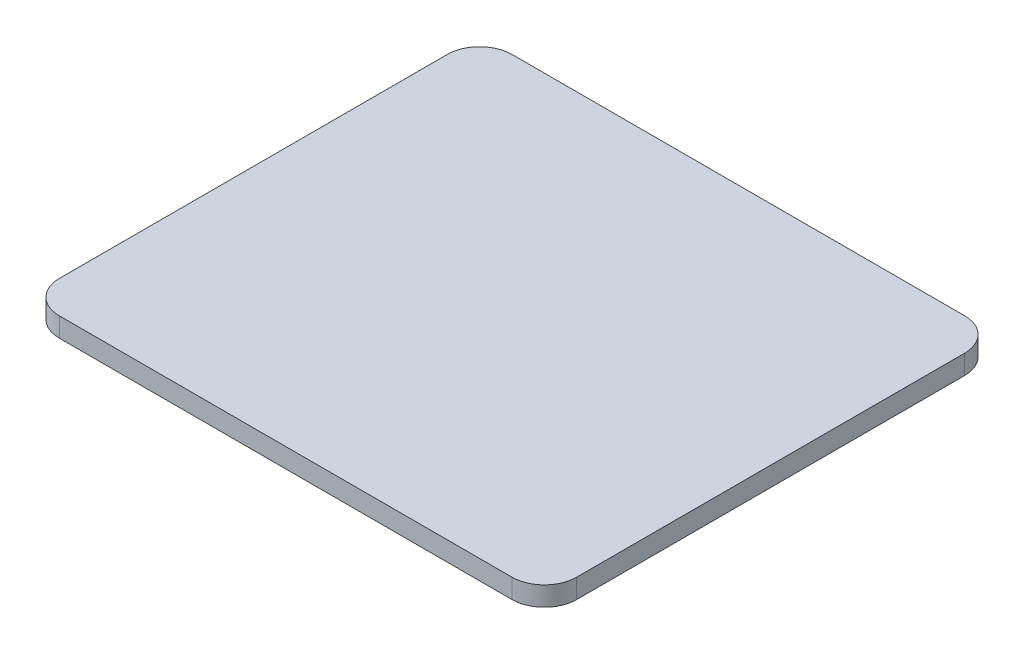
ISO-10303-21;
HEADER;
FILE_DESCRIPTION(('STEP AP214'),'2;1');
FILE_NAME('part.step','',(''),(''),'','','');
FILE_SCHEMA(('AUTOMOTIVE_DESIGN { 1 0 10303 214 1 1 1 1 }'));
ENDSEC;
DATA;
#1=APPLICATION_CONTEXT('core data for automotive mechanical design processes');
#2=APPLICATION_PROTOCOL_DEFINITION('international standard','automotive_design',2000,#1);
#3=PRODUCT_CONTEXT('',#1,'mechanical');
#4=PRODUCT('Part','Part','',(#3));
#5=PRODUCT_RELATED_PRODUCT_CATEGORY('part','',(#4));
#6=PRODUCT_DEFINITION_FORMATION('','',#4);
#7=PRODUCT_DEFINITION_CONTEXT('part definition',#1,'design');
#8=PRODUCT_DEFINITION('design','',#6,#7);
#9=PRODUCT_DEFINITION_SHAPE('','',#8);
#10=(LENGTH_UNIT() NAMED_UNIT(*) SI_UNIT(.MILLI.,.METRE.));
#11=(NAMED_UNIT(*) PLANE_ANGLE_UNIT() SI_UNIT($,.RADIAN.));
#12=(NAMED_UNIT(*) SI_UNIT($,.STERADIAN.) SOLID_ANGLE_UNIT());
#13=UNCERTAINTY_MEASURE_WITH_UNIT(LENGTH_MEASURE(1.E-05),#10,'distance_accuracy_value','');
#14=(GEOMETRIC_REPRESENTATION_CONTEXT(3) GLOBAL_UNCERTAINTY_ASSIGNED_CONTEXT((#13)) GLOBAL_UNIT_ASSIGNED_CONTEXT((#10,
#11,#12)) REPRESENTATION_CONTEXT('',''));
#15=CARTESIAN_POINT('',(0.,0.,0.));
#16=DIRECTION('',(0.,0.,1.));
#17=DIRECTION('',(1.,0.,0.));
#18=AXIS2_PLACEMENT_3D('',#15,#16,#17);
#19=CARTESIAN_POINT('',(7.,0.,0.));
#20=DIRECTION('',(-1.,0.,0.));
#21=DIRECTION('',(0.,0.,1.));
#22=AXIS2_PLACEMENT_3D('',#19,#20,#21);
#23=CYLINDRICAL_SURFACE('',#22,1.);
#24=CARTESIAN_POINT('',(4.4,0.,0.));
#25=DIRECTION('',(1.,0.,0.));
#26=DIRECTION('',(0.,0.,-1.));
#27=AXIS2_PLACEMENT_3D('',#24,#25,#26);
#28=CIRCLE('',#27,1.);
#29=CARTESIAN_POINT('',(4.4,0.,-1.));
#30=VERTEX_POINT('',#29);
#31=EDGE_CURVE('E186',#30,#30,#28,.T.);
#32=ORIENTED_EDGE('',*,*,#31,.T.);
#33=EDGE_LOOP('',(#32));
#34=FACE_BOUND('',#33,.T.);
#35=CARTESIAN_POINT('',(2.2,0.,0.));
#36=DIRECTION('',(-1.,0.,0.));
#37=DIRECTION('',(0.,0.,1.));
#38=AXIS2_PLACEMENT_3D('',#35,#36,#37);
#39=CIRCLE('',#38,1.);
#40=CARTESIAN_POINT('',(2.2,0.,1.));
#41=VERTEX_POINT('',#40);
#42=EDGE_CURVE('E43',#41,#41,#39,.T.);
#43=ORIENTED_EDGE('',*,*,#42,.T.);
#44=EDGE_LOOP('',(#43));
#45=FACE_BOUND('',#44,.T.);
#46=ADVANCED_FACE('F39',(#34,#45),#23,.F.);
#47=CARTESIAN_POINT('',(7.,0.,0.));
#48=DIRECTION('',(1.,0.,0.));
#49=DIRECTION('',(0.,0.,-1.));
#50=AXIS2_PLACEMENT_3D('',#47,#48,#49);
#51=PLANE('',#50);
#52=CARTESIAN_POINT('',(7.,0.,0.));
#53=DIRECTION('',(1.,0.,0.));
#54=DIRECTION('',(0.,0.,-1.));
#55=AXIS2_PLACEMENT_3D('',#52,#53,#54);
#56=CIRCLE('',#55,2.5);
#57=CARTESIAN_POINT('',(7.,0.,-2.5));
#58=VERTEX_POINT('',#57);
#59=EDGE_CURVE('E194',#58,#58,#56,.T.);
#60=ORIENTED_EDGE('',*,*,#59,.F.);
#61=EDGE_LOOP('',(#60));
#62=FACE_BOUND('',#61,.T.);
#63=CARTESIAN_POINT('',(7.,0.,0.));
#64=DIRECTION('',(1.,0.,0.));
#65=DIRECTION('',(0.,0.,-1.));
#66=AXIS2_PLACEMENT_3D('',#63,#64,#65);
#67=CIRCLE('',#66,5.);
#68=CARTESIAN_POINT('',(7.,0.,5.));
#69=VERTEX_POINT('',#68);
#70=CARTESIAN_POINT('',(7.,0.,-5.));
#71=VERTEX_POINT('',#70);
#72=EDGE_CURVE('E170',#69,#71,#67,.T.);
#73=ORIENTED_EDGE('',*,*,#72,.T.);
#74=DIRECTION('',(0.,1.,0.));
#75=VECTOR('',#74,1.);
#76=CARTESIAN_POINT('',(7.,0.,-5.));
#77=LINE('',#76,#75);
#78=CARTESIAN_POINT('',(7.,20.,-5.));
#79=VERTEX_POINT('',#78);
#80=EDGE_CURVE('E82',#71,#79,#77,.T.);
#81=ORIENTED_EDGE('',*,*,#80,.T.);
#82=DIRECTION('',(0.,0.,1.));
#83=VECTOR('',#82,1.);
#84=CARTESIAN_POINT('',(7.,20.,5.));
#85=LINE('',#84,#83);
#86=CARTESIAN_POINT('',(7.,20.,5.));
#87=VERTEX_POINT('',#86);
#88=EDGE_CURVE('E173',#79,#87,#85,.T.);
#89=ORIENTED_EDGE('',*,*,#88,.T.);
#90=DIRECTION('',(0.,-1.,0.));
#91=VECTOR('',#90,1.);
#92=CARTESIAN_POINT('',(7.,0.,5.));
#93=LINE('',#92,#91);
#94=EDGE_CURVE('E58',#87,#69,#93,.T.);
#95=ORIENTED_EDGE('',*,*,#94,.T.);
#96=EDGE_LOOP('',(#73,#81,#89,#95));
#97=FACE_BOUND('',#96,.T.);
#98=ADVANCED_FACE('F273',(#62,#97),#51,.T.);
#99=CARTESIAN_POINT('',(0.,0.,0.));
#100=DIRECTION('',(1.,0.,0.));
#101=DIRECTION('',(0.,0.,-1.));
#102=AXIS2_PLACEMENT_3D('',#99,#100,#101);
#103=PLANE('',#102);
#104=CARTESIAN_POINT('',(0.,0.,0.));
#105=DIRECTION('',(-1.,0.,0.));
#106=DIRECTION('',(0.,0.,1.));
#107=AXIS2_PLACEMENT_3D('',#104,#105,#106);
#108=CIRCLE('',#107,2.6);
#109=CARTESIAN_POINT('',(0.,0.,2.6));
#110=VERTEX_POINT('',#109);
#111=EDGE_CURVE('E201',#110,#110,#108,.T.);
#112=ORIENTED_EDGE('',*,*,#111,.F.);
#113=EDGE_LOOP('',(#112));
#114=FACE_BOUND('',#113,.T.);
#115=CARTESIAN_POINT('',(0.,0.,0.));
#116=DIRECTION('',(1.,0.,0.));
#117=DIRECTION('',(0.,0.,-1.));
#118=AXIS2_PLACEMENT_3D('',#115,#116,#117);
#119=CIRCLE('',#118,5.);
#120=CARTESIAN_POINT('',(0.,0.,5.));
#121=VERTEX_POINT('',#120);
#122=CARTESIAN_POINT('',(0.,0.,-5.));
#123=VERTEX_POINT('',#122);
#124=EDGE_CURVE('E161',#121,#123,#119,.T.);
#125=ORIENTED_EDGE('',*,*,#124,.F.);
#126=DIRECTION('',(0.,-1.,0.));
#127=VECTOR('',#126,1.);
#128=CARTESIAN_POINT('',(0.,0.,5.));
#129=LINE('',#128,#127);
#130=CARTESIAN_POINT('',(0.,20.,5.));
#131=VERTEX_POINT('',#130);
#132=EDGE_CURVE('E75',#131,#121,#129,.T.);
#133=ORIENTED_EDGE('',*,*,#132,.F.);
#134=DIRECTION('',(0.,0.,1.));
#135=VECTOR('',#134,1.);
#136=CARTESIAN_POINT('',(0.,20.,5.));
#137=LINE('',#136,#135);
#138=CARTESIAN_POINT('',(0.,20.,-5.));
#139=VERTEX_POINT('',#138);
#140=EDGE_CURVE('E179',#139,#131,#137,.T.);
#141=ORIENTED_EDGE('',*,*,#140,.F.);
#142=DIRECTION('',(0.,1.,0.));
#143=VECTOR('',#142,1.);
#144=CARTESIAN_POINT('',(0.,0.,-5.));
#145=LINE('',#144,#143);
#146=EDGE_CURVE('E164',#123,#139,#145,.T.);
#147=ORIENTED_EDGE('',*,*,#146,.F.);
#148=EDGE_LOOP('',(#125,#133,#141,#147));
#149=FACE_BOUND('',#148,.T.);
#150=ADVANCED_FACE('F280',(#114,#149),#103,.F.);
#151=CARTESIAN_POINT('',(7.,0.,0.));
#152=DIRECTION('',(-1.,0.,0.));
#153=DIRECTION('',(0.,0.,1.));
#154=AXIS2_PLACEMENT_3D('',#151,#152,#153);
#155=CYLINDRICAL_SURFACE('',#154,5.);
#156=ORIENTED_EDGE('',*,*,#124,.T.);
#157=DIRECTION('',(-1.,0.,0.));
#158=VECTOR('',#157,1.);
#159=CARTESIAN_POINT('',(7.,0.,-5.));
#160=LINE('',#159,#158);
#161=EDGE_CURVE('E11',#71,#123,#160,.T.);
#162=ORIENTED_EDGE('',*,*,#161,.F.);
#163=ORIENTED_EDGE('',*,*,#72,.F.);
#164=DIRECTION('',(-1.,0.,0.));
#165=VECTOR('',#164,1.);
#166=CARTESIAN_POINT('',(7.,0.,5.));
#167=LINE('',#166,#165);
#168=EDGE_CURVE('E175',#69,#121,#167,.T.);
#169=ORIENTED_EDGE('',*,*,#168,.T.);
#170=EDGE_LOOP('',(#156,#162,#163,#169));
#171=FACE_BOUND('',#170,.T.);
#172=ADVANCED_FACE('F41',(#171),#155,.T.);
#173=CARTESIAN_POINT('',(7.,0.,-5.));
#174=DIRECTION('',(0.,0.,1.));
#175=DIRECTION('',(1.,0.,0.));
#176=AXIS2_PLACEMENT_3D('',#173,#174,#175);
#177=PLANE('',#176);
#178=ORIENTED_EDGE('',*,*,#146,.T.);
#179=DIRECTION('',(-1.,0.,0.));
#180=VECTOR('',#179,1.);
#181=CARTESIAN_POINT('',(7.,20.,-5.));
#182=LINE('',#181,#180);
#183=EDGE_CURVE('E49',#79,#139,#182,.T.);
#184=ORIENTED_EDGE('',*,*,#183,.F.);
#185=ORIENTED_EDGE('',*,*,#80,.F.);
#186=ORIENTED_EDGE('',*,*,#161,.T.);
#187=EDGE_LOOP('',(#178,#184,#185,#186));
#188=FACE_BOUND('',#187,.T.);
#189=ADVANCED_FACE('F290',(#188),#177,.F.);
#190=CARTESIAN_POINT('',(7.,0.,5.));
#191=DIRECTION('',(0.,0.,-1.));
#192=DIRECTION('',(-1.,0.,0.));
#193=AXIS2_PLACEMENT_3D('',#190,#191,#192);
#194=PLANE('',#193);
#195=ORIENTED_EDGE('',*,*,#132,.T.);
#196=ORIENTED_EDGE('',*,*,#168,.F.);
#197=ORIENTED_EDGE('',*,*,#94,.F.);
#198=DIRECTION('',(-1.,0.,0.));
#199=VECTOR('',#198,1.);
#200=CARTESIAN_POINT('',(7.,20.,5.));
#201=LINE('',#200,#199);
#202=EDGE_CURVE('E72',#87,#131,#201,.T.);
#203=ORIENTED_EDGE('',*,*,#202,.T.);
#204=EDGE_LOOP('',(#195,#196,#197,#203));
#205=FACE_BOUND('',#204,.T.);
#206=ADVANCED_FACE('F288',(#205),#194,.F.);
#207=CARTESIAN_POINT('',(42.1024787786415,23.,-30.));
#208=DIRECTION('',(0.,-1.,0.));
#209=DIRECTION('',(0.,0.,-1.));
#210=AXIS2_PLACEMENT_3D('',#207,#208,#209);
#211=CYLINDRICAL_SURFACE('',#210,5.);
#212=CARTESIAN_POINT('',(42.1024787786415,20.,-30.));
#213=DIRECTION('',(0.,1.,0.));
#214=DIRECTION('',(0.,0.,-1.));
#215=AXIS2_PLACEMENT_3D('',#212,#213,#214);
#216=CIRCLE('',#215,5.);
#217=CARTESIAN_POINT('',(47.1024787786415,20.,-30.));
#218=VERTEX_POINT('',#217);
#219=CARTESIAN_POINT('',(42.1024787786415,20.,-35.));
#220=VERTEX_POINT('',#219);
#221=EDGE_CURVE('E160',#218,#220,#216,.T.);
#222=ORIENTED_EDGE('',*,*,#221,.T.);
#223=DIRECTION('',(0.,-1.,0.));
#224=VECTOR('',#223,1.);
#225=CARTESIAN_POINT('',(42.1024787786415,23.,-35.));
#226=LINE('',#225,#224);
#227=CARTESIAN_POINT('',(42.1024787786415,23.,-35.));
#228=VERTEX_POINT('',#227);
#229=EDGE_CURVE('E140',#228,#220,#226,.T.);
#230=ORIENTED_EDGE('',*,*,#229,.F.);
#231=CARTESIAN_POINT('',(42.1024787786415,23.,-30.));
#232=DIRECTION('',(0.,1.,0.));
#233=DIRECTION('',(0.,0.,-1.));
#234=AXIS2_PLACEMENT_3D('',#231,#232,#233);
#235=CIRCLE('',#234,5.);
#236=CARTESIAN_POINT('',(47.1024787786415,23.,-30.));
#237=VERTEX_POINT('',#236);
#238=EDGE_CURVE('E147',#237,#228,#235,.T.);
#239=ORIENTED_EDGE('',*,*,#238,.F.);
#240=DIRECTION('',(0.,-1.,0.));
#241=VECTOR('',#240,1.);
#242=CARTESIAN_POINT('',(47.1024787786415,23.,-30.));
#243=LINE('',#242,#241);
#244=EDGE_CURVE('E213',#237,#218,#243,.T.);
#245=ORIENTED_EDGE('',*,*,#244,.T.);
#246=EDGE_LOOP('',(#222,#230,#239,#245));
#247=FACE_BOUND('',#246,.T.);
#248=ADVANCED_FACE('F158',(#247),#211,.T.);
#249=CARTESIAN_POINT('',(-27.8975212213585,23.,-35.));
#250=DIRECTION('',(0.,0.,1.));
#251=DIRECTION('',(1.,0.,0.));
#252=AXIS2_PLACEMENT_3D('',#249,#250,#251);
#253=PLANE('',#252);
#254=DIRECTION('',(-1.,0.,0.));
#255=VECTOR('',#254,1.);
#256=CARTESIAN_POINT('',(-27.8975212213585,20.,-35.));
#257=LINE('',#256,#255);
#258=CARTESIAN_POINT('',(-27.8975212213585,20.,-35.));
#259=VERTEX_POINT('',#258);
#260=EDGE_CURVE('E191',#220,#259,#257,.T.);
#261=ORIENTED_EDGE('',*,*,#260,.T.);
#262=DIRECTION('',(0.,-1.,0.));
#263=VECTOR('',#262,1.);
#264=CARTESIAN_POINT('',(-27.8975212213585,23.,-35.));
#265=LINE('',#264,#263);
#266=CARTESIAN_POINT('',(-27.8975212213585,23.,-35.));
#267=VERTEX_POINT('',#266);
#268=EDGE_CURVE('E143',#267,#259,#265,.T.);
#269=ORIENTED_EDGE('',*,*,#268,.F.);
#270=DIRECTION('',(-1.,0.,0.));
#271=VECTOR('',#270,1.);
#272=CARTESIAN_POINT('',(-27.8975212213585,23.,-35.));
#273=LINE('',#272,#271);
#274=EDGE_CURVE('E136',#228,#267,#273,.T.);
#275=ORIENTED_EDGE('',*,*,#274,.F.);
#276=ORIENTED_EDGE('',*,*,#229,.T.);
#277=EDGE_LOOP('',(#261,#269,#275,#276));
#278=FACE_BOUND('',#277,.T.);
#279=ADVANCED_FACE('F138',(#278),#253,.F.);
#280=CARTESIAN_POINT('',(-27.8975212213585,23.,-30.));
#281=DIRECTION('',(0.,-1.,0.));
#282=DIRECTION('',(0.,0.,-1.));
#283=AXIS2_PLACEMENT_3D('',#280,#281,#282);
#284=CYLINDRICAL_SURFACE('',#283,5.);
#285=CARTESIAN_POINT('',(-27.8975212213585,20.,-30.));
#286=DIRECTION('',(0.,1.,0.));
#287=DIRECTION('',(0.,0.,-1.));
#288=AXIS2_PLACEMENT_3D('',#285,#286,#287);
#289=CIRCLE('',#288,5.);
#290=CARTESIAN_POINT('',(-32.8975212213585,20.,-30.));
#291=VERTEX_POINT('',#290);
#292=EDGE_CURVE('E216',#259,#291,#289,.T.);
#293=ORIENTED_EDGE('',*,*,#292,.T.);
#294=DIRECTION('',(0.,-1.,0.));
#295=VECTOR('',#294,1.);
#296=CARTESIAN_POINT('',(-32.8975212213585,23.,-30.));
#297=LINE('',#296,#295);
#298=CARTESIAN_POINT('',(-32.8975212213585,23.,-30.));
#299=VERTEX_POINT('',#298);
#300=EDGE_CURVE('E166',#299,#291,#297,.T.);
#301=ORIENTED_EDGE('',*,*,#300,.F.);
#302=CARTESIAN_POINT('',(-27.8975212213585,23.,-30.));
#303=DIRECTION('',(0.,1.,0.));
#304=DIRECTION('',(0.,0.,-1.));
#305=AXIS2_PLACEMENT_3D('',#302,#303,#304);
#306=CIRCLE('',#305,5.);
#307=EDGE_CURVE('E146',#267,#299,#306,.T.);
#308=ORIENTED_EDGE('',*,*,#307,.F.);
#309=ORIENTED_EDGE('',*,*,#268,.T.);
#310=EDGE_LOOP('',(#293,#301,#308,#309));
#311=FACE_BOUND('',#310,.T.);
#312=ADVANCED_FACE('F263',(#311),#284,.T.);
#313=CARTESIAN_POINT('',(-32.8975212213585,23.,30.));
#314=DIRECTION('',(1.,0.,0.));
#315=DIRECTION('',(0.,0.,-1.));
#316=AXIS2_PLACEMENT_3D('',#313,#314,#315);
#317=PLANE('',#316);
#318=DIRECTION('',(0.,0.,1.));
#319=VECTOR('',#318,1.);
#320=CARTESIAN_POINT('',(-32.8975212213585,20.,30.));
#321=LINE('',#320,#319);
#322=CARTESIAN_POINT('',(-32.8975212213585,20.,30.));
#323=VERTEX_POINT('',#322);
#324=EDGE_CURVE('E218',#291,#323,#321,.T.);
#325=ORIENTED_EDGE('',*,*,#324,.T.);
#326=DIRECTION('',(0.,-1.,0.));
#327=VECTOR('',#326,1.);
#328=CARTESIAN_POINT('',(-32.8975212213585,23.,30.));
#329=LINE('',#328,#327);
#330=CARTESIAN_POINT('',(-32.8975212213585,23.,30.));
#331=VERTEX_POINT('',#330);
#332=EDGE_CURVE('E237',#331,#323,#329,.T.);
#333=ORIENTED_EDGE('',*,*,#332,.F.);
#334=DIRECTION('',(0.,0.,1.));
#335=VECTOR('',#334,1.);
#336=CARTESIAN_POINT('',(-32.8975212213585,23.,30.));
#337=LINE('',#336,#335);
#338=EDGE_CURVE('E205',#299,#331,#337,.T.);
#339=ORIENTED_EDGE('',*,*,#338,.F.);
#340=ORIENTED_EDGE('',*,*,#300,.T.);
#341=EDGE_LOOP('',(#325,#333,#339,#340));
#342=FACE_BOUND('',#341,.T.);
#343=ADVANCED_FACE('F244',(#342),#317,.F.);
#344=CARTESIAN_POINT('',(-27.8975212213585,23.,30.));
#345=DIRECTION('',(0.,-1.,0.));
#346=DIRECTION('',(0.,0.,-1.));
#347=AXIS2_PLACEMENT_3D('',#344,#345,#346);
#348=CYLINDRICAL_SURFACE('',#347,5.);
#349=CARTESIAN_POINT('',(-27.8975212213585,20.,30.));
#350=DIRECTION('',(0.,1.,0.));
#351=DIRECTION('',(0.,0.,-1.));
#352=AXIS2_PLACEMENT_3D('',#349,#350,#351);
#353=CIRCLE('',#352,5.);
#354=CARTESIAN_POINT('',(-27.8975212213585,20.,35.));
#355=VERTEX_POINT('',#354);
#356=EDGE_CURVE('E220',#323,#355,#353,.T.);
#357=ORIENTED_EDGE('',*,*,#356,.T.);
#358=DIRECTION('',(0.,-1.,0.));
#359=VECTOR('',#358,1.);
#360=CARTESIAN_POINT('',(-27.8975212213585,23.,35.));
#361=LINE('',#360,#359);
#362=CARTESIAN_POINT('',(-27.8975212213585,23.,35.));
#363=VERTEX_POINT('',#362);
#364=EDGE_CURVE('E234',#363,#355,#361,.T.);
#365=ORIENTED_EDGE('',*,*,#364,.F.);
#366=CARTESIAN_POINT('',(-27.8975212213585,23.,30.));
#367=DIRECTION('',(0.,1.,0.));
#368=DIRECTION('',(0.,0.,-1.));
#369=AXIS2_PLACEMENT_3D('',#366,#367,#368);
#370=CIRCLE('',#369,5.);
#371=EDGE_CURVE('E207',#331,#363,#370,.T.);
#372=ORIENTED_EDGE('',*,*,#371,.F.);
#373=ORIENTED_EDGE('',*,*,#332,.T.);
#374=EDGE_LOOP('',(#357,#365,#372,#373));
#375=FACE_BOUND('',#374,.T.);
#376=ADVANCED_FACE('F255',(#375),#348,.T.);
#377=CARTESIAN_POINT('',(-27.8975212213585,23.,35.));
#378=DIRECTION('',(0.,0.,-1.));
#379=DIRECTION('',(-1.,0.,0.));
#380=AXIS2_PLACEMENT_3D('',#377,#378,#379);
#381=PLANE('',#380);
#382=DIRECTION('',(1.,0.,0.));
#383=VECTOR('',#382,1.);
#384=CARTESIAN_POINT('',(-27.8975212213585,20.,35.));
#385=LINE('',#384,#383);
#386=CARTESIAN_POINT('',(42.1024787786415,20.,35.));
#387=VERTEX_POINT('',#386);
#388=EDGE_CURVE('E222',#355,#387,#385,.T.);
#389=ORIENTED_EDGE('',*,*,#388,.T.);
#390=DIRECTION('',(0.,-1.,0.));
#391=VECTOR('',#390,1.);
#392=CARTESIAN_POINT('',(42.1024787786415,23.,35.));
#393=LINE('',#392,#391);
#394=CARTESIAN_POINT('',(42.1024787786415,23.,35.));
#395=VERTEX_POINT('',#394);
#396=EDGE_CURVE('E231',#395,#387,#393,.T.);
#397=ORIENTED_EDGE('',*,*,#396,.F.);
#398=DIRECTION('',(1.,0.,0.));
#399=VECTOR('',#398,1.);
#400=CARTESIAN_POINT('',(-27.8975212213585,23.,35.));
#401=LINE('',#400,#399);
#402=EDGE_CURVE('E209',#363,#395,#401,.T.);
#403=ORIENTED_EDGE('',*,*,#402,.F.);
#404=ORIENTED_EDGE('',*,*,#364,.T.);
#405=EDGE_LOOP('',(#389,#397,#403,#404));
#406=FACE_BOUND('',#405,.T.);
#407=ADVANCED_FACE('F259',(#406),#381,.F.);
#408=CARTESIAN_POINT('',(42.1024787786415,23.,30.));
#409=DIRECTION('',(0.,-1.,0.));
#410=DIRECTION('',(0.,0.,-1.));
#411=AXIS2_PLACEMENT_3D('',#408,#409,#410);
#412=CYLINDRICAL_SURFACE('',#411,5.);
#413=CARTESIAN_POINT('',(42.1024787786415,20.,30.));
#414=DIRECTION('',(0.,1.,0.));
#415=DIRECTION('',(0.,0.,1.));
#416=AXIS2_PLACEMENT_3D('',#413,#414,#415);
#417=CIRCLE('',#416,5.);
#418=CARTESIAN_POINT('',(47.1024787786415,20.,30.));
#419=VERTEX_POINT('',#418);
#420=EDGE_CURVE('E224',#387,#419,#417,.T.);
#421=ORIENTED_EDGE('',*,*,#420,.T.);
#422=DIRECTION('',(0.,-1.,0.));
#423=VECTOR('',#422,1.);
#424=CARTESIAN_POINT('',(47.1024787786415,23.,30.));
#425=LINE('',#424,#423);
#426=CARTESIAN_POINT('',(47.1024787786415,23.,30.));
#427=VERTEX_POINT('',#426);
#428=EDGE_CURVE('E228',#427,#419,#425,.T.);
#429=ORIENTED_EDGE('',*,*,#428,.F.);
#430=CARTESIAN_POINT('',(42.1024787786415,23.,30.));
#431=DIRECTION('',(0.,1.,0.));
#432=DIRECTION('',(0.,0.,1.));
#433=AXIS2_PLACEMENT_3D('',#430,#431,#432);
#434=CIRCLE('',#433,5.);
#435=EDGE_CURVE('E211',#395,#427,#434,.T.);
#436=ORIENTED_EDGE('',*,*,#435,.F.);
#437=ORIENTED_EDGE('',*,*,#396,.T.);
#438=EDGE_LOOP('',(#421,#429,#436,#437));
#439=FACE_BOUND('',#438,.T.);
#440=ADVANCED_FACE('F317',(#439),#412,.T.);
#441=CARTESIAN_POINT('',(47.1024787786415,23.,30.));
#442=DIRECTION('',(-1.,0.,0.));
#443=DIRECTION('',(0.,0.,1.));
#444=AXIS2_PLACEMENT_3D('',#441,#442,#443);
#445=PLANE('',#444);
#446=DIRECTION('',(0.,0.,-1.));
#447=VECTOR('',#446,1.);
#448=CARTESIAN_POINT('',(47.1024787786415,20.,30.));
#449=LINE('',#448,#447);
#450=EDGE_CURVE('E156',#419,#218,#449,.T.);
#451=ORIENTED_EDGE('',*,*,#450,.T.);
#452=ORIENTED_EDGE('',*,*,#244,.F.);
#453=DIRECTION('',(0.,0.,-1.));
#454=VECTOR('',#453,1.);
#455=CARTESIAN_POINT('',(47.1024787786415,23.,30.));
#456=LINE('',#455,#454);
#457=EDGE_CURVE('E152',#427,#237,#456,.T.);
#458=ORIENTED_EDGE('',*,*,#457,.F.);
#459=ORIENTED_EDGE('',*,*,#428,.T.);
#460=EDGE_LOOP('',(#451,#452,#458,#459));
#461=FACE_BOUND('',#460,.T.);
#462=ADVANCED_FACE('F312',(#461),#445,.F.);
#463=CARTESIAN_POINT('',(42.1024787786415,23.,-30.));
#464=DIRECTION('',(0.,-1.,0.));
#465=DIRECTION('',(0.,0.,-1.));
#466=AXIS2_PLACEMENT_3D('',#463,#464,#465);
#467=PLANE('',#466);
#468=ORIENTED_EDGE('',*,*,#238,.T.);
#469=ORIENTED_EDGE('',*,*,#274,.T.);
#470=ORIENTED_EDGE('',*,*,#307,.T.);
#471=ORIENTED_EDGE('',*,*,#338,.T.);
#472=ORIENTED_EDGE('',*,*,#371,.T.);
#473=ORIENTED_EDGE('',*,*,#402,.T.);
#474=ORIENTED_EDGE('',*,*,#435,.T.);
#475=ORIENTED_EDGE('',*,*,#457,.T.);
#476=EDGE_LOOP('',(#468,#469,#470,#471,#472,#473,#474,#475));
#477=FACE_BOUND('',#476,.T.);
#478=ADVANCED_FACE('F150',(#477),#467,.F.);
#479=CARTESIAN_POINT('',(42.1024787786415,20.,-30.));
#480=DIRECTION('',(0.,-1.,0.));
#481=DIRECTION('',(0.,0.,-1.));
#482=AXIS2_PLACEMENT_3D('',#479,#480,#481);
#483=PLANE('',#482);
#484=ORIENTED_EDGE('',*,*,#183,.T.);
#485=ORIENTED_EDGE('',*,*,#140,.T.);
#486=ORIENTED_EDGE('',*,*,#202,.F.);
#487=ORIENTED_EDGE('',*,*,#88,.F.);
#488=EDGE_LOOP('',(#484,#485,#486,#487));
#489=FACE_BOUND('',#488,.T.);
#490=ORIENTED_EDGE('',*,*,#221,.F.);
#491=ORIENTED_EDGE('',*,*,#450,.F.);
#492=ORIENTED_EDGE('',*,*,#420,.F.);
#493=ORIENTED_EDGE('',*,*,#388,.F.);
#494=ORIENTED_EDGE('',*,*,#356,.F.);
#495=ORIENTED_EDGE('',*,*,#324,.F.);
#496=ORIENTED_EDGE('',*,*,#292,.F.);
#497=ORIENTED_EDGE('',*,*,#260,.F.);
#498=EDGE_LOOP('',(#490,#491,#492,#493,#494,#495,#496,#497));
#499=FACE_BOUND('',#498,.T.);
#500=ADVANCED_FACE('F250',(#489,#499),#483,.T.);
#501=CARTESIAN_POINT('',(4.4,0.,0.));
#502=DIRECTION('',(1.,0.,0.));
#503=DIRECTION('',(0.,0.,-1.));
#504=AXIS2_PLACEMENT_3D('',#501,#502,#503);
#505=CYLINDRICAL_SURFACE('',#504,2.5);
#506=CARTESIAN_POINT('',(4.4,0.,0.));
#507=DIRECTION('',(1.,0.,0.));
#508=DIRECTION('',(0.,0.,-1.));
#509=AXIS2_PLACEMENT_3D('',#506,#507,#508);
#510=CIRCLE('',#509,2.5);
#511=CARTESIAN_POINT('',(4.4,0.,-2.5));
#512=VERTEX_POINT('',#511);
#513=EDGE_CURVE('E188',#512,#512,#510,.T.);
#514=ORIENTED_EDGE('',*,*,#513,.F.);
#515=EDGE_LOOP('',(#514));
#516=FACE_BOUND('',#515,.T.);
#517=ORIENTED_EDGE('',*,*,#59,.T.);
#518=EDGE_LOOP('',(#517));
#519=FACE_BOUND('',#518,.T.);
#520=ADVANCED_FACE('F303',(#516,#519),#505,.F.);
#521=CARTESIAN_POINT('',(4.4,0.,0.));
#522=DIRECTION('',(1.,0.,0.));
#523=DIRECTION('',(0.,0.,-1.));
#524=AXIS2_PLACEMENT_3D('',#521,#522,#523);
#525=PLANE('',#524);
#526=ORIENTED_EDGE('',*,*,#31,.F.);
#527=EDGE_LOOP('',(#526));
#528=FACE_BOUND('',#527,.T.);
#529=ORIENTED_EDGE('',*,*,#513,.T.);
#530=EDGE_LOOP('',(#529));
#531=FACE_BOUND('',#530,.T.);
#532=ADVANCED_FACE('F309',(#528,#531),#525,.T.);
#533=CARTESIAN_POINT('',(2.2,0.,0.));
#534=DIRECTION('',(-1.,0.,0.));
#535=DIRECTION('',(0.,0.,1.));
#536=AXIS2_PLACEMENT_3D('',#533,#534,#535);
#537=CYLINDRICAL_SURFACE('',#536,2.6);
#538=CARTESIAN_POINT('',(2.2,0.,0.));
#539=DIRECTION('',(-1.,0.,0.));
#540=DIRECTION('',(0.,0.,1.));
#541=AXIS2_PLACEMENT_3D('',#538,#539,#540);
#542=CIRCLE('',#541,2.6);
#543=CARTESIAN_POINT('',(2.2,0.,2.6));
#544=VERTEX_POINT('',#543);
#545=EDGE_CURVE('E400',#544,#544,#542,.T.);
#546=ORIENTED_EDGE('',*,*,#545,.F.);
#547=EDGE_LOOP('',(#546));
#548=FACE_BOUND('',#547,.T.);
#549=ORIENTED_EDGE('',*,*,#111,.T.);
#550=EDGE_LOOP('',(#549));
#551=FACE_BOUND('',#550,.T.);
#552=ADVANCED_FACE('F367',(#548,#551),#537,.F.);
#553=CARTESIAN_POINT('',(2.2,0.,0.));
#554=DIRECTION('',(-1.,0.,0.));
#555=DIRECTION('',(0.,0.,1.));
#556=AXIS2_PLACEMENT_3D('',#553,#554,#555);
#557=PLANE('',#556);
#558=ORIENTED_EDGE('',*,*,#42,.F.);
#559=EDGE_LOOP('',(#558));
#560=FACE_BOUND('',#559,.T.);
#561=ORIENTED_EDGE('',*,*,#545,.T.);
#562=EDGE_LOOP('',(#561));
#563=FACE_BOUND('',#562,.T.);
#564=ADVANCED_FACE('F382',(#560,#563),#557,.T.);
#565=CLOSED_SHELL('',(#46,#98,#150,#172,#189,#206,#248,#279,#312,#343,#376,#407,#440,#462,#478,
#500,#520,#532,#552,#564));
#566=MANIFOLD_SOLID_BREP('B2',#565);
#567=ADVANCED_BREP_SHAPE_REPRESENTATION('',(#18,#566),#14);
#568=SHAPE_DEFINITION_REPRESENTATION(#9,#567);
ENDSEC;
END-ISO-10303-21;
